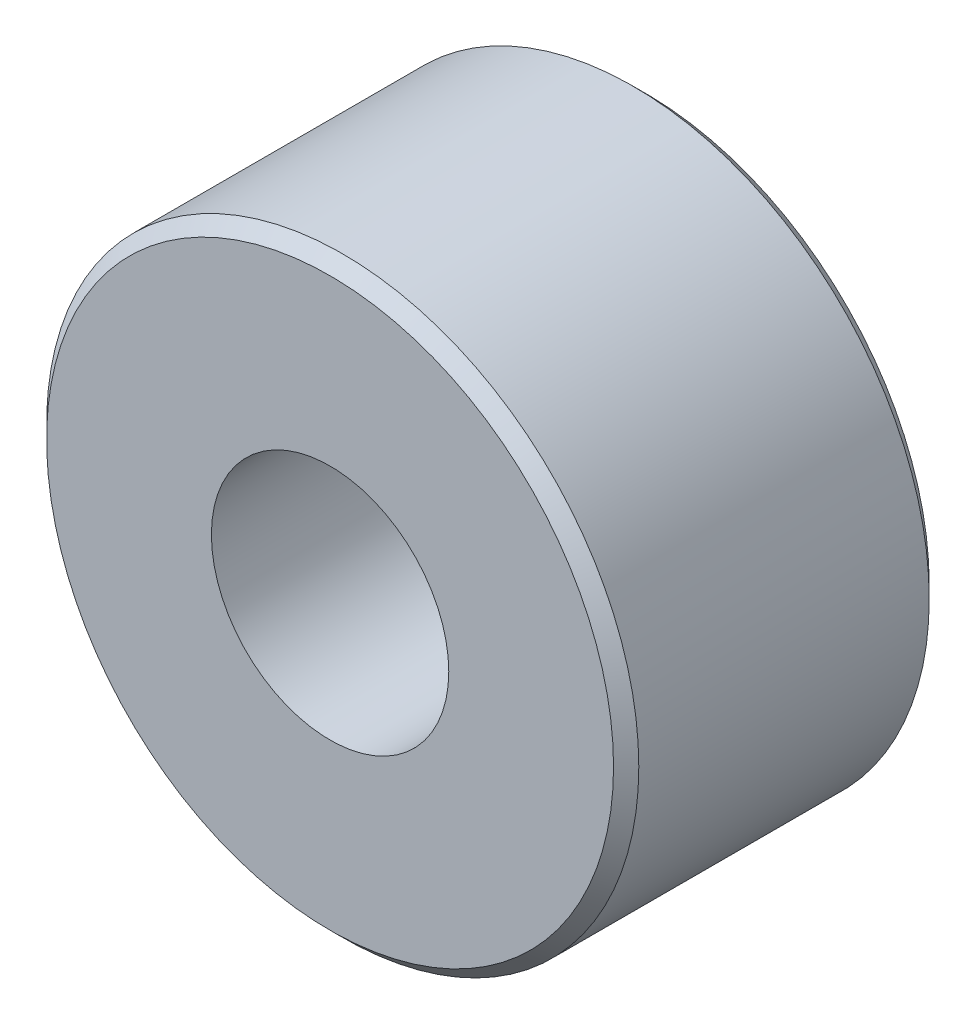
ISO-10303-21;
HEADER;
FILE_DESCRIPTION(('STEP AP214'),'2;1');
FILE_NAME('part.step','',(''),(''),'','','');
FILE_SCHEMA(('AUTOMOTIVE_DESIGN { 1 0 10303 214 1 1 1 1 }'));
ENDSEC;
DATA;
#1=APPLICATION_CONTEXT('core data for automotive mechanical design processes');
#2=APPLICATION_PROTOCOL_DEFINITION('international standard','automotive_design',2000,#1);
#3=PRODUCT_CONTEXT('',#1,'mechanical');
#4=PRODUCT('Part','Part','',(#3));
#5=PRODUCT_RELATED_PRODUCT_CATEGORY('part','',(#4));
#6=PRODUCT_DEFINITION_FORMATION('','',#4);
#7=PRODUCT_DEFINITION_CONTEXT('part definition',#1,'design');
#8=PRODUCT_DEFINITION('design','',#6,#7);
#9=PRODUCT_DEFINITION_SHAPE('','',#8);
#10=(LENGTH_UNIT() NAMED_UNIT(*) SI_UNIT(.MILLI.,.METRE.));
#11=(NAMED_UNIT(*) PLANE_ANGLE_UNIT() SI_UNIT($,.RADIAN.));
#12=(NAMED_UNIT(*) SI_UNIT($,.STERADIAN.) SOLID_ANGLE_UNIT());
#13=UNCERTAINTY_MEASURE_WITH_UNIT(LENGTH_MEASURE(1.E-05),#10,'distance_accuracy_value','');
#14=(GEOMETRIC_REPRESENTATION_CONTEXT(3) GLOBAL_UNCERTAINTY_ASSIGNED_CONTEXT((#13)) GLOBAL_UNIT_ASSIGNED_CONTEXT((#10,
#11,#12)) REPRESENTATION_CONTEXT('',''));
#15=CARTESIAN_POINT('',(0.,0.,0.));
#16=DIRECTION('',(0.,0.,1.));
#17=DIRECTION('',(1.,0.,0.));
#18=AXIS2_PLACEMENT_3D('',#15,#16,#17);
#19=CARTESIAN_POINT('',(0.,0.,3.175));
#20=DIRECTION('',(0.,0.,-1.));
#21=DIRECTION('',(-1.,0.,0.));
#22=AXIS2_PLACEMENT_3D('',#19,#20,#21);
#23=CYLINDRICAL_SURFACE('',#22,5.9563);
#24=CARTESIAN_POINT('',(0.,0.,-2.921));
#25=DIRECTION('',(0.,0.,1.));
#26=DIRECTION('',(1.,0.,0.));
#27=AXIS2_PLACEMENT_3D('',#24,#25,#26);
#28=CIRCLE('',#27,5.9563);
#29=CARTESIAN_POINT('',(5.9563,0.,-2.921));
#30=VERTEX_POINT('',#29);
#31=EDGE_CURVE('E39',#30,#30,#28,.T.);
#32=ORIENTED_EDGE('',*,*,#31,.T.);
#33=EDGE_LOOP('',(#32));
#34=FACE_BOUND('',#33,.T.);
#35=CARTESIAN_POINT('',(0.,0.,2.921));
#36=DIRECTION('',(0.,0.,1.));
#37=DIRECTION('',(1.,0.,0.));
#38=AXIS2_PLACEMENT_3D('',#35,#36,#37);
#39=CIRCLE('',#38,5.9563);
#40=CARTESIAN_POINT('',(5.9563,0.,2.921));
#41=VERTEX_POINT('',#40);
#42=EDGE_CURVE('E43',#41,#41,#39,.F.);
#43=ORIENTED_EDGE('',*,*,#42,.T.);
#44=EDGE_LOOP('',(#43));
#45=FACE_BOUND('',#44,.T.);
#46=ADVANCED_FACE('F28',(#34,#45),#23,.T.);
#47=CARTESIAN_POINT('',(0.,0.,3.175));
#48=DIRECTION('',(0.,0.,1.));
#49=DIRECTION('',(1.,0.,0.));
#50=AXIS2_PLACEMENT_3D('',#47,#48,#49);
#51=PLANE('',#50);
#52=CARTESIAN_POINT('',(0.,0.,3.175));
#53=DIRECTION('',(0.,0.,1.));
#54=DIRECTION('',(1.,0.,0.));
#55=AXIS2_PLACEMENT_3D('',#52,#53,#54);
#56=CIRCLE('',#55,5.7023);
#57=CARTESIAN_POINT('',(5.7023,0.,3.175));
#58=VERTEX_POINT('',#57);
#59=EDGE_CURVE('E10',#58,#58,#56,.T.);
#60=ORIENTED_EDGE('',*,*,#59,.T.);
#61=EDGE_LOOP('',(#60));
#62=FACE_BOUND('',#61,.T.);
#63=CARTESIAN_POINT('',(0.,0.,3.175));
#64=DIRECTION('',(0.,0.,1.));
#65=DIRECTION('',(1.,0.,0.));
#66=AXIS2_PLACEMENT_3D('',#63,#64,#65);
#67=CIRCLE('',#66,2.3876);
#68=CARTESIAN_POINT('',(2.3876,0.,3.175));
#69=VERTEX_POINT('',#68);
#70=EDGE_CURVE('E49',#69,#69,#67,.T.);
#71=ORIENTED_EDGE('',*,*,#70,.F.);
#72=EDGE_LOOP('',(#71));
#73=FACE_BOUND('',#72,.T.);
#74=ADVANCED_FACE('F64',(#62,#73),#51,.T.);
#75=CARTESIAN_POINT('',(0.,0.,-3.175));
#76=DIRECTION('',(0.,0.,1.));
#77=DIRECTION('',(1.,0.,0.));
#78=AXIS2_PLACEMENT_3D('',#75,#76,#77);
#79=PLANE('',#78);
#80=CARTESIAN_POINT('',(0.,0.,-3.175));
#81=DIRECTION('',(0.,0.,1.));
#82=DIRECTION('',(1.,0.,0.));
#83=AXIS2_PLACEMENT_3D('',#80,#81,#82);
#84=CIRCLE('',#83,5.7023);
#85=CARTESIAN_POINT('',(5.7023,0.,-3.175));
#86=VERTEX_POINT('',#85);
#87=EDGE_CURVE('E35',#86,#86,#84,.F.);
#88=ORIENTED_EDGE('',*,*,#87,.T.);
#89=EDGE_LOOP('',(#88));
#90=FACE_BOUND('',#89,.T.);
#91=CARTESIAN_POINT('',(0.,0.,-3.175));
#92=DIRECTION('',(0.,0.,1.));
#93=DIRECTION('',(1.,0.,0.));
#94=AXIS2_PLACEMENT_3D('',#91,#92,#93);
#95=CIRCLE('',#94,2.3876);
#96=CARTESIAN_POINT('',(2.3876,0.,-3.175));
#97=VERTEX_POINT('',#96);
#98=EDGE_CURVE('E48',#97,#97,#95,.T.);
#99=ORIENTED_EDGE('',*,*,#98,.T.);
#100=EDGE_LOOP('',(#99));
#101=FACE_BOUND('',#100,.T.);
#102=ADVANCED_FACE('F55',(#90,#101),#79,.F.);
#103=CARTESIAN_POINT('',(0.,0.,-3.175));
#104=DIRECTION('',(0.,0.,1.));
#105=DIRECTION('',(1.,0.,0.));
#106=AXIS2_PLACEMENT_3D('',#103,#104,#105);
#107=CYLINDRICAL_SURFACE('',#106,2.3876);
#108=ORIENTED_EDGE('',*,*,#98,.F.);
#109=EDGE_LOOP('',(#108));
#110=FACE_BOUND('',#109,.T.);
#111=ORIENTED_EDGE('',*,*,#70,.T.);
#112=EDGE_LOOP('',(#111));
#113=FACE_BOUND('',#112,.T.);
#114=ADVANCED_FACE('F57',(#110,#113),#107,.F.);
#115=CARTESIAN_POINT('',(0.,0.,-2.921));
#116=DIRECTION('',(0.,0.,1.));
#117=DIRECTION('',(1.,0.,0.));
#118=AXIS2_PLACEMENT_3D('',#115,#116,#117);
#119=CONICAL_SURFACE('',#118,5.9563,0.785398163397453);
#120=ORIENTED_EDGE('',*,*,#87,.F.);
#121=EDGE_LOOP('',(#120));
#122=FACE_BOUND('',#121,.T.);
#123=ORIENTED_EDGE('',*,*,#31,.F.);
#124=EDGE_LOOP('',(#123));
#125=FACE_BOUND('',#124,.T.);
#126=ADVANCED_FACE('F60',(#122,#125),#119,.T.);
#127=CARTESIAN_POINT('',(0.,0.,3.175));
#128=DIRECTION('',(0.,0.,-1.));
#129=DIRECTION('',(-1.,0.,0.));
#130=AXIS2_PLACEMENT_3D('',#127,#128,#129);
#131=CONICAL_SURFACE('',#130,5.7023,0.785398163397447);
#132=ORIENTED_EDGE('',*,*,#42,.F.);
#133=EDGE_LOOP('',(#132));
#134=FACE_BOUND('',#133,.T.);
#135=ORIENTED_EDGE('',*,*,#59,.F.);
#136=EDGE_LOOP('',(#135));
#137=FACE_BOUND('',#136,.T.);
#138=ADVANCED_FACE('F30',(#134,#137),#131,.T.);
#139=CLOSED_SHELL('',(#46,#74,#102,#114,#126,#138));
#140=MANIFOLD_SOLID_BREP('B2',#139);
#141=ADVANCED_BREP_SHAPE_REPRESENTATION('',(#18,#140),#14);
#142=SHAPE_DEFINITION_REPRESENTATION(#9,#141);
ENDSEC;
END-ISO-10303-21;
